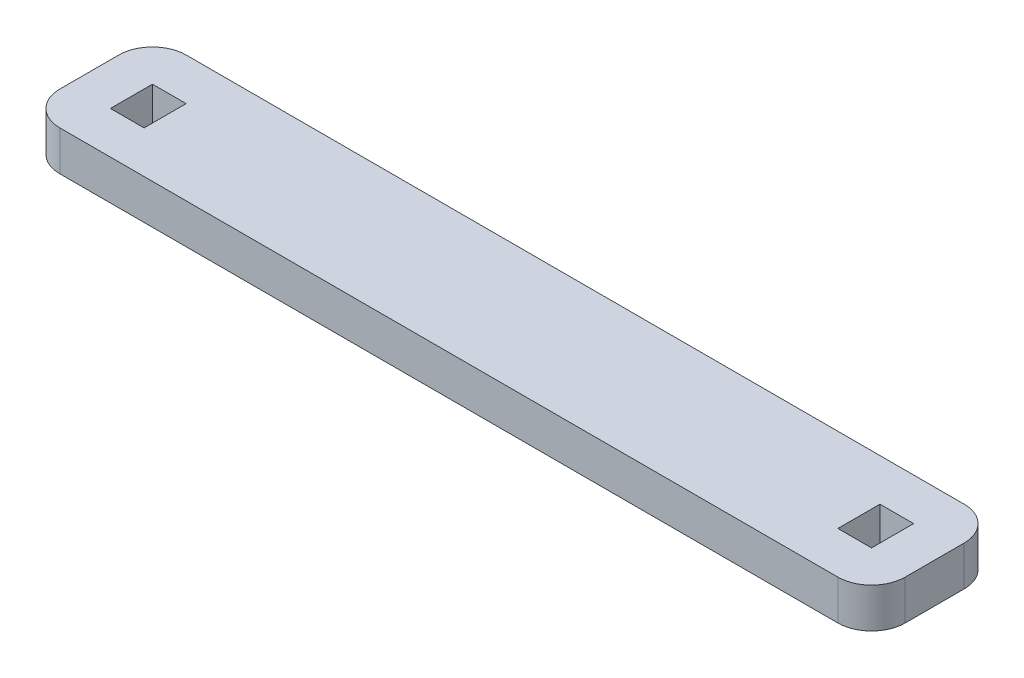
ISO-10303-21;
HEADER;
FILE_DESCRIPTION(('STEP AP214'),'2;1');
FILE_NAME('part.step','',(''),(''),'','','');
FILE_SCHEMA(('AUTOMOTIVE_DESIGN { 1 0 10303 214 1 1 1 1 }'));
ENDSEC;
DATA;
#1=APPLICATION_CONTEXT('core data for automotive mechanical design processes');
#2=APPLICATION_PROTOCOL_DEFINITION('international standard','automotive_design',2000,#1);
#3=PRODUCT_CONTEXT('',#1,'mechanical');
#4=PRODUCT('Part','Part','',(#3));
#5=PRODUCT_RELATED_PRODUCT_CATEGORY('part','',(#4));
#6=PRODUCT_DEFINITION_FORMATION('','',#4);
#7=PRODUCT_DEFINITION_CONTEXT('part definition',#1,'design');
#8=PRODUCT_DEFINITION('design','',#6,#7);
#9=PRODUCT_DEFINITION_SHAPE('','',#8);
#10=(LENGTH_UNIT() NAMED_UNIT(*) SI_UNIT(.MILLI.,.METRE.));
#11=(NAMED_UNIT(*) PLANE_ANGLE_UNIT() SI_UNIT($,.RADIAN.));
#12=(NAMED_UNIT(*) SI_UNIT($,.STERADIAN.) SOLID_ANGLE_UNIT());
#13=UNCERTAINTY_MEASURE_WITH_UNIT(LENGTH_MEASURE(1.E-05),#10,'distance_accuracy_value','');
#14=(GEOMETRIC_REPRESENTATION_CONTEXT(3) GLOBAL_UNCERTAINTY_ASSIGNED_CONTEXT((#13)) GLOBAL_UNIT_ASSIGNED_CONTEXT((#10,
#11,#12)) REPRESENTATION_CONTEXT('',''));
#15=CARTESIAN_POINT('',(0.,0.,0.));
#16=DIRECTION('',(0.,0.,1.));
#17=DIRECTION('',(1.,0.,0.));
#18=AXIS2_PLACEMENT_3D('',#15,#16,#17);
#19=CARTESIAN_POINT('',(0.,1.5,0.));
#20=DIRECTION('',(0.,1.,0.));
#21=DIRECTION('',(0.,0.,1.));
#22=AXIS2_PLACEMENT_3D('',#19,#20,#21);
#23=PLANE('',#22);
#24=DIRECTION('',(-1.,0.,0.));
#25=VECTOR('',#24,1.);
#26=CARTESIAN_POINT('',(31.877,1.5,-4.7625));
#27=LINE('',#26,#25);
#28=CARTESIAN_POINT('',(29.337,1.5,-4.7625));
#29=VERTEX_POINT('',#28);
#30=CARTESIAN_POINT('',(-29.337,1.5,-4.7625));
#31=VERTEX_POINT('',#30);
#32=EDGE_CURVE('E274',#29,#31,#27,.T.);
#33=ORIENTED_EDGE('',*,*,#32,.T.);
#34=CARTESIAN_POINT('',(-29.337,1.5,-2.2225));
#35=DIRECTION('',(0.,1.,0.));
#36=DIRECTION('',(0.,0.,1.));
#37=AXIS2_PLACEMENT_3D('',#34,#35,#36);
#38=CIRCLE('',#37,2.54);
#39=CARTESIAN_POINT('',(-31.877,1.5,-2.2225));
#40=VERTEX_POINT('',#39);
#41=EDGE_CURVE('E310',#31,#40,#38,.T.);
#42=ORIENTED_EDGE('',*,*,#41,.T.);
#43=DIRECTION('',(0.,0.,1.));
#44=VECTOR('',#43,1.);
#45=CARTESIAN_POINT('',(-31.877,1.5,4.7625));
#46=LINE('',#45,#44);
#47=CARTESIAN_POINT('',(-31.877,1.5,2.2225));
#48=VERTEX_POINT('',#47);
#49=EDGE_CURVE('E244',#40,#48,#46,.T.);
#50=ORIENTED_EDGE('',*,*,#49,.T.);
#51=CARTESIAN_POINT('',(-29.337,1.5,2.2225));
#52=DIRECTION('',(0.,1.,0.));
#53=DIRECTION('',(0.,0.,1.));
#54=AXIS2_PLACEMENT_3D('',#51,#52,#53);
#55=CIRCLE('',#54,2.54);
#56=CARTESIAN_POINT('',(-29.337,1.5,4.7625));
#57=VERTEX_POINT('',#56);
#58=EDGE_CURVE('E260',#48,#57,#55,.T.);
#59=ORIENTED_EDGE('',*,*,#58,.T.);
#60=DIRECTION('',(1.,0.,0.));
#61=VECTOR('',#60,1.);
#62=CARTESIAN_POINT('',(31.877,1.5,4.7625));
#63=LINE('',#62,#61);
#64=CARTESIAN_POINT('',(29.337,1.5,4.7625));
#65=VERTEX_POINT('',#64);
#66=EDGE_CURVE('E248',#57,#65,#63,.T.);
#67=ORIENTED_EDGE('',*,*,#66,.T.);
#68=CARTESIAN_POINT('',(29.337,1.5,2.2225));
#69=DIRECTION('',(0.,1.,0.));
#70=DIRECTION('',(0.,0.,1.));
#71=AXIS2_PLACEMENT_3D('',#68,#69,#70);
#72=CIRCLE('',#71,2.54);
#73=CARTESIAN_POINT('',(31.877,1.5,2.2225));
#74=VERTEX_POINT('',#73);
#75=EDGE_CURVE('E66',#65,#74,#72,.T.);
#76=ORIENTED_EDGE('',*,*,#75,.T.);
#77=DIRECTION('',(0.,0.,-1.));
#78=VECTOR('',#77,1.);
#79=CARTESIAN_POINT('',(31.877,1.5,4.7625));
#80=LINE('',#79,#78);
#81=CARTESIAN_POINT('',(31.877,1.5,-2.2225));
#82=VERTEX_POINT('',#81);
#83=EDGE_CURVE('E271',#74,#82,#80,.T.);
#84=ORIENTED_EDGE('',*,*,#83,.T.);
#85=CARTESIAN_POINT('',(29.337,1.5,-2.2225));
#86=DIRECTION('',(0.,1.,0.));
#87=DIRECTION('',(0.,0.,1.));
#88=AXIS2_PLACEMENT_3D('',#85,#86,#87);
#89=CIRCLE('',#88,2.54);
#90=EDGE_CURVE('E268',#82,#29,#89,.T.);
#91=ORIENTED_EDGE('',*,*,#90,.T.);
#92=EDGE_LOOP('',(#33,#42,#50,#59,#67,#76,#84,#91));
#93=FACE_BOUND('',#92,.T.);
#94=DIRECTION('',(1.,0.,0.));
#95=VECTOR('',#94,1.);
#96=CARTESIAN_POINT('',(-26.162,1.5,1.5875));
#97=LINE('',#96,#95);
#98=CARTESIAN_POINT('',(-28.702,1.5,1.5875));
#99=VERTEX_POINT('',#98);
#100=CARTESIAN_POINT('',(-26.162,1.5,1.5875));
#101=VERTEX_POINT('',#100);
#102=EDGE_CURVE('E211',#99,#101,#97,.T.);
#103=ORIENTED_EDGE('',*,*,#102,.F.);
#104=DIRECTION('',(0.,0.,1.));
#105=VECTOR('',#104,1.);
#106=CARTESIAN_POINT('',(-28.702,1.5,1.5875));
#107=LINE('',#106,#105);
#108=CARTESIAN_POINT('',(-28.702,1.5,-1.5875));
#109=VERTEX_POINT('',#108);
#110=EDGE_CURVE('E208',#109,#99,#107,.T.);
#111=ORIENTED_EDGE('',*,*,#110,.F.);
#112=DIRECTION('',(-1.,0.,0.));
#113=VECTOR('',#112,1.);
#114=CARTESIAN_POINT('',(-26.162,1.5,-1.5875));
#115=LINE('',#114,#113);
#116=CARTESIAN_POINT('',(-26.162,1.5,-1.5875));
#117=VERTEX_POINT('',#116);
#118=EDGE_CURVE('E218',#117,#109,#115,.T.);
#119=ORIENTED_EDGE('',*,*,#118,.F.);
#120=DIRECTION('',(0.,0.,-1.));
#121=VECTOR('',#120,1.);
#122=CARTESIAN_POINT('',(-26.162,1.5,1.5875));
#123=LINE('',#122,#121);
#124=EDGE_CURVE('E222',#101,#117,#123,.T.);
#125=ORIENTED_EDGE('',*,*,#124,.F.);
#126=EDGE_LOOP('',(#103,#111,#119,#125));
#127=FACE_BOUND('',#126,.T.);
#128=DIRECTION('',(1.,0.,0.));
#129=VECTOR('',#128,1.);
#130=CARTESIAN_POINT('',(28.702,1.5,1.5875));
#131=LINE('',#130,#129);
#132=CARTESIAN_POINT('',(26.162,1.5,1.5875));
#133=VERTEX_POINT('',#132);
#134=CARTESIAN_POINT('',(28.702,1.5,1.5875));
#135=VERTEX_POINT('',#134);
#136=EDGE_CURVE('E169',#133,#135,#131,.T.);
#137=ORIENTED_EDGE('',*,*,#136,.F.);
#138=DIRECTION('',(0.,0.,1.));
#139=VECTOR('',#138,1.);
#140=CARTESIAN_POINT('',(26.162,1.5,1.5875));
#141=LINE('',#140,#139);
#142=CARTESIAN_POINT('',(26.162,1.5,-1.5875));
#143=VERTEX_POINT('',#142);
#144=EDGE_CURVE('E159',#143,#133,#141,.T.);
#145=ORIENTED_EDGE('',*,*,#144,.F.);
#146=DIRECTION('',(-1.,0.,0.));
#147=VECTOR('',#146,1.);
#148=CARTESIAN_POINT('',(28.702,1.5,-1.5875));
#149=LINE('',#148,#147);
#150=CARTESIAN_POINT('',(28.702,1.5,-1.5875));
#151=VERTEX_POINT('',#150);
#152=EDGE_CURVE('E184',#151,#143,#149,.T.);
#153=ORIENTED_EDGE('',*,*,#152,.F.);
#154=DIRECTION('',(0.,0.,-1.));
#155=VECTOR('',#154,1.);
#156=CARTESIAN_POINT('',(28.702,1.5,1.5875));
#157=LINE('',#156,#155);
#158=EDGE_CURVE('E182',#135,#151,#157,.T.);
#159=ORIENTED_EDGE('',*,*,#158,.F.);
#160=EDGE_LOOP('',(#137,#145,#153,#159));
#161=FACE_BOUND('',#160,.T.);
#162=ADVANCED_FACE('F44',(#93,#127,#161),#23,.T.);
#163=CARTESIAN_POINT('',(0.,-1.5,0.));
#164=DIRECTION('',(0.,1.,0.));
#165=DIRECTION('',(0.,0.,1.));
#166=AXIS2_PLACEMENT_3D('',#163,#164,#165);
#167=PLANE('',#166);
#168=DIRECTION('',(0.,0.,1.));
#169=VECTOR('',#168,1.);
#170=CARTESIAN_POINT('',(-28.702,-1.5,1.5875));
#171=LINE('',#170,#169);
#172=CARTESIAN_POINT('',(-28.702,-1.5,-1.5875));
#173=VERTEX_POINT('',#172);
#174=CARTESIAN_POINT('',(-28.702,-1.5,1.5875));
#175=VERTEX_POINT('',#174);
#176=EDGE_CURVE('E177',#173,#175,#171,.T.);
#177=ORIENTED_EDGE('',*,*,#176,.T.);
#178=DIRECTION('',(1.,0.,0.));
#179=VECTOR('',#178,1.);
#180=CARTESIAN_POINT('',(-26.162,-1.5,1.5875));
#181=LINE('',#180,#179);
#182=CARTESIAN_POINT('',(-26.162,-1.5,1.5875));
#183=VERTEX_POINT('',#182);
#184=EDGE_CURVE('E226',#175,#183,#181,.T.);
#185=ORIENTED_EDGE('',*,*,#184,.T.);
#186=DIRECTION('',(0.,0.,-1.));
#187=VECTOR('',#186,1.);
#188=CARTESIAN_POINT('',(-26.162,-1.5,1.5875));
#189=LINE('',#188,#187);
#190=CARTESIAN_POINT('',(-26.162,-1.5,-1.5875));
#191=VERTEX_POINT('',#190);
#192=EDGE_CURVE('E229',#183,#191,#189,.T.);
#193=ORIENTED_EDGE('',*,*,#192,.T.);
#194=DIRECTION('',(-1.,0.,0.));
#195=VECTOR('',#194,1.);
#196=CARTESIAN_POINT('',(-26.162,-1.5,-1.5875));
#197=LINE('',#196,#195);
#198=EDGE_CURVE('E212',#191,#173,#197,.T.);
#199=ORIENTED_EDGE('',*,*,#198,.T.);
#200=EDGE_LOOP('',(#177,#185,#193,#199));
#201=FACE_BOUND('',#200,.T.);
#202=DIRECTION('',(0.,0.,1.));
#203=VECTOR('',#202,1.);
#204=CARTESIAN_POINT('',(-31.877,-1.5,4.7625));
#205=LINE('',#204,#203);
#206=CARTESIAN_POINT('',(-31.877,-1.5,-2.2225));
#207=VERTEX_POINT('',#206);
#208=CARTESIAN_POINT('',(-31.877,-1.5,2.2225));
#209=VERTEX_POINT('',#208);
#210=EDGE_CURVE('E243',#207,#209,#205,.T.);
#211=ORIENTED_EDGE('',*,*,#210,.F.);
#212=CARTESIAN_POINT('',(-29.337,-1.5,-2.2225));
#213=DIRECTION('',(0.,1.,0.));
#214=DIRECTION('',(0.,0.,1.));
#215=AXIS2_PLACEMENT_3D('',#212,#213,#214);
#216=CIRCLE('',#215,2.54);
#217=CARTESIAN_POINT('',(-29.337,-1.5,-4.7625));
#218=VERTEX_POINT('',#217);
#219=EDGE_CURVE('E298',#207,#218,#216,.F.);
#220=ORIENTED_EDGE('',*,*,#219,.T.);
#221=DIRECTION('',(-1.,0.,0.));
#222=VECTOR('',#221,1.);
#223=CARTESIAN_POINT('',(31.877,-1.5,-4.7625));
#224=LINE('',#223,#222);
#225=CARTESIAN_POINT('',(29.337,-1.5,-4.7625));
#226=VERTEX_POINT('',#225);
#227=EDGE_CURVE('E249',#226,#218,#224,.T.);
#228=ORIENTED_EDGE('',*,*,#227,.F.);
#229=CARTESIAN_POINT('',(29.337,-1.5,-2.2225));
#230=DIRECTION('',(0.,1.,0.));
#231=DIRECTION('',(0.,0.,1.));
#232=AXIS2_PLACEMENT_3D('',#229,#230,#231);
#233=CIRCLE('',#232,2.54);
#234=CARTESIAN_POINT('',(31.877,-1.5,-2.2225));
#235=VERTEX_POINT('',#234);
#236=EDGE_CURVE('E296',#226,#235,#233,.F.);
#237=ORIENTED_EDGE('',*,*,#236,.T.);
#238=DIRECTION('',(0.,0.,-1.));
#239=VECTOR('',#238,1.);
#240=CARTESIAN_POINT('',(31.877,-1.5,4.7625));
#241=LINE('',#240,#239);
#242=CARTESIAN_POINT('',(31.877,-1.5,2.2225));
#243=VERTEX_POINT('',#242);
#244=EDGE_CURVE('E284',#243,#235,#241,.T.);
#245=ORIENTED_EDGE('',*,*,#244,.F.);
#246=CARTESIAN_POINT('',(29.337,-1.5,2.2225));
#247=DIRECTION('',(0.,1.,0.));
#248=DIRECTION('',(0.,0.,1.));
#249=AXIS2_PLACEMENT_3D('',#246,#247,#248);
#250=CIRCLE('',#249,2.54);
#251=CARTESIAN_POINT('',(29.337,-1.5,4.7625));
#252=VERTEX_POINT('',#251);
#253=EDGE_CURVE('E294',#243,#252,#250,.F.);
#254=ORIENTED_EDGE('',*,*,#253,.T.);
#255=DIRECTION('',(1.,0.,0.));
#256=VECTOR('',#255,1.);
#257=CARTESIAN_POINT('',(31.877,-1.5,4.7625));
#258=LINE('',#257,#256);
#259=CARTESIAN_POINT('',(-29.337,-1.5,4.7625));
#260=VERTEX_POINT('',#259);
#261=EDGE_CURVE('E281',#260,#252,#258,.T.);
#262=ORIENTED_EDGE('',*,*,#261,.F.);
#263=CARTESIAN_POINT('',(-29.337,-1.5,2.2225));
#264=DIRECTION('',(0.,1.,0.));
#265=DIRECTION('',(0.,0.,1.));
#266=AXIS2_PLACEMENT_3D('',#263,#264,#265);
#267=CIRCLE('',#266,2.54);
#268=EDGE_CURVE('E292',#260,#209,#267,.F.);
#269=ORIENTED_EDGE('',*,*,#268,.T.);
#270=EDGE_LOOP('',(#211,#220,#228,#237,#245,#254,#262,#269));
#271=FACE_BOUND('',#270,.T.);
#272=DIRECTION('',(0.,0.,1.));
#273=VECTOR('',#272,1.);
#274=CARTESIAN_POINT('',(26.162,-1.5,1.5875));
#275=LINE('',#274,#273);
#276=CARTESIAN_POINT('',(26.162,-1.5,-1.5875));
#277=VERTEX_POINT('',#276);
#278=CARTESIAN_POINT('',(26.162,-1.5,1.5875));
#279=VERTEX_POINT('',#278);
#280=EDGE_CURVE('E196',#277,#279,#275,.T.);
#281=ORIENTED_EDGE('',*,*,#280,.T.);
#282=DIRECTION('',(1.,0.,0.));
#283=VECTOR('',#282,1.);
#284=CARTESIAN_POINT('',(28.702,-1.5,1.5875));
#285=LINE('',#284,#283);
#286=CARTESIAN_POINT('',(28.702,-1.5,1.5875));
#287=VERTEX_POINT('',#286);
#288=EDGE_CURVE('E176',#279,#287,#285,.T.);
#289=ORIENTED_EDGE('',*,*,#288,.T.);
#290=DIRECTION('',(0.,0.,-1.));
#291=VECTOR('',#290,1.);
#292=CARTESIAN_POINT('',(28.702,-1.5,1.5875));
#293=LINE('',#292,#291);
#294=CARTESIAN_POINT('',(28.702,-1.5,-1.5875));
#295=VERTEX_POINT('',#294);
#296=EDGE_CURVE('E199',#287,#295,#293,.T.);
#297=ORIENTED_EDGE('',*,*,#296,.T.);
#298=DIRECTION('',(-1.,0.,0.));
#299=VECTOR('',#298,1.);
#300=CARTESIAN_POINT('',(28.702,-1.5,-1.5875));
#301=LINE('',#300,#299);
#302=EDGE_CURVE('E170',#295,#277,#301,.T.);
#303=ORIENTED_EDGE('',*,*,#302,.T.);
#304=EDGE_LOOP('',(#281,#289,#297,#303));
#305=FACE_BOUND('',#304,.T.);
#306=ADVANCED_FACE('F331',(#201,#271,#305),#167,.F.);
#307=CARTESIAN_POINT('',(-31.877,1.5,4.7625));
#308=DIRECTION('',(1.,0.,0.));
#309=DIRECTION('',(0.,0.,-1.));
#310=AXIS2_PLACEMENT_3D('',#307,#308,#309);
#311=PLANE('',#310);
#312=ORIENTED_EDGE('',*,*,#49,.F.);
#313=DIRECTION('',(0.,-1.,0.));
#314=VECTOR('',#313,1.);
#315=CARTESIAN_POINT('',(-31.877,1.5,-2.2225));
#316=LINE('',#315,#314);
#317=EDGE_CURVE('E289',#40,#207,#316,.T.);
#318=ORIENTED_EDGE('',*,*,#317,.T.);
#319=ORIENTED_EDGE('',*,*,#210,.T.);
#320=DIRECTION('',(0.,-1.,0.));
#321=VECTOR('',#320,1.);
#322=CARTESIAN_POINT('',(-31.877,1.5,2.2225));
#323=LINE('',#322,#321);
#324=EDGE_CURVE('E278',#209,#48,#323,.F.);
#325=ORIENTED_EDGE('',*,*,#324,.T.);
#326=EDGE_LOOP('',(#312,#318,#319,#325));
#327=FACE_BOUND('',#326,.T.);
#328=ADVANCED_FACE('F341',(#327),#311,.F.);
#329=CARTESIAN_POINT('',(31.877,1.5,4.7625));
#330=DIRECTION('',(0.,0.,-1.));
#331=DIRECTION('',(-1.,0.,0.));
#332=AXIS2_PLACEMENT_3D('',#329,#330,#331);
#333=PLANE('',#332);
#334=ORIENTED_EDGE('',*,*,#261,.T.);
#335=DIRECTION('',(0.,-1.,0.));
#336=VECTOR('',#335,1.);
#337=CARTESIAN_POINT('',(29.337,1.5,4.7625));
#338=LINE('',#337,#336);
#339=EDGE_CURVE('E12',#252,#65,#338,.F.);
#340=ORIENTED_EDGE('',*,*,#339,.T.);
#341=ORIENTED_EDGE('',*,*,#66,.F.);
#342=DIRECTION('',(0.,-1.,0.));
#343=VECTOR('',#342,1.);
#344=CARTESIAN_POINT('',(-29.337,1.5,4.7625));
#345=LINE('',#344,#343);
#346=EDGE_CURVE('E52',#57,#260,#345,.T.);
#347=ORIENTED_EDGE('',*,*,#346,.T.);
#348=EDGE_LOOP('',(#334,#340,#341,#347));
#349=FACE_BOUND('',#348,.T.);
#350=ADVANCED_FACE('F325',(#349),#333,.F.);
#351=CARTESIAN_POINT('',(31.877,1.5,4.7625));
#352=DIRECTION('',(-1.,0.,0.));
#353=DIRECTION('',(0.,0.,1.));
#354=AXIS2_PLACEMENT_3D('',#351,#352,#353);
#355=PLANE('',#354);
#356=ORIENTED_EDGE('',*,*,#244,.T.);
#357=DIRECTION('',(0.,-1.,0.));
#358=VECTOR('',#357,1.);
#359=CARTESIAN_POINT('',(31.877,1.5,-2.2225));
#360=LINE('',#359,#358);
#361=EDGE_CURVE('E59',#235,#82,#360,.F.);
#362=ORIENTED_EDGE('',*,*,#361,.T.);
#363=ORIENTED_EDGE('',*,*,#83,.F.);
#364=DIRECTION('',(0.,-1.,0.));
#365=VECTOR('',#364,1.);
#366=CARTESIAN_POINT('',(31.877,1.5,2.2225));
#367=LINE('',#366,#365);
#368=EDGE_CURVE('E315',#74,#243,#367,.T.);
#369=ORIENTED_EDGE('',*,*,#368,.T.);
#370=EDGE_LOOP('',(#356,#362,#363,#369));
#371=FACE_BOUND('',#370,.T.);
#372=ADVANCED_FACE('F337',(#371),#355,.F.);
#373=CARTESIAN_POINT('',(31.877,1.5,-4.7625));
#374=DIRECTION('',(0.,0.,1.));
#375=DIRECTION('',(1.,0.,0.));
#376=AXIS2_PLACEMENT_3D('',#373,#374,#375);
#377=PLANE('',#376);
#378=ORIENTED_EDGE('',*,*,#227,.T.);
#379=DIRECTION('',(0.,-1.,0.));
#380=VECTOR('',#379,1.);
#381=CARTESIAN_POINT('',(-29.337,1.5,-4.7625));
#382=LINE('',#381,#380);
#383=EDGE_CURVE('E264',#218,#31,#382,.F.);
#384=ORIENTED_EDGE('',*,*,#383,.T.);
#385=ORIENTED_EDGE('',*,*,#32,.F.);
#386=DIRECTION('',(0.,-1.,0.));
#387=VECTOR('',#386,1.);
#388=CARTESIAN_POINT('',(29.337,1.5,-4.7625));
#389=LINE('',#388,#387);
#390=EDGE_CURVE('E299',#29,#226,#389,.T.);
#391=ORIENTED_EDGE('',*,*,#390,.T.);
#392=EDGE_LOOP('',(#378,#384,#385,#391));
#393=FACE_BOUND('',#392,.T.);
#394=ADVANCED_FACE('F306',(#393),#377,.F.);
#395=CARTESIAN_POINT('',(-28.702,1.5,1.5875));
#396=DIRECTION('',(1.,0.,0.));
#397=DIRECTION('',(0.,0.,-1.));
#398=AXIS2_PLACEMENT_3D('',#395,#396,#397);
#399=PLANE('',#398);
#400=ORIENTED_EDGE('',*,*,#176,.F.);
#401=DIRECTION('',(0.,-1.,0.));
#402=VECTOR('',#401,1.);
#403=CARTESIAN_POINT('',(-28.702,1.5,-1.5875));
#404=LINE('',#403,#402);
#405=EDGE_CURVE('E221',#109,#173,#404,.T.);
#406=ORIENTED_EDGE('',*,*,#405,.F.);
#407=ORIENTED_EDGE('',*,*,#110,.T.);
#408=DIRECTION('',(0.,-1.,0.));
#409=VECTOR('',#408,1.);
#410=CARTESIAN_POINT('',(-28.702,1.5,1.5875));
#411=LINE('',#410,#409);
#412=EDGE_CURVE('E240',#99,#175,#411,.T.);
#413=ORIENTED_EDGE('',*,*,#412,.T.);
#414=EDGE_LOOP('',(#400,#406,#407,#413));
#415=FACE_BOUND('',#414,.T.);
#416=ADVANCED_FACE('F356',(#415),#399,.T.);
#417=CARTESIAN_POINT('',(-26.162,1.5,1.5875));
#418=DIRECTION('',(0.,0.,-1.));
#419=DIRECTION('',(-1.,0.,0.));
#420=AXIS2_PLACEMENT_3D('',#417,#418,#419);
#421=PLANE('',#420);
#422=ORIENTED_EDGE('',*,*,#184,.F.);
#423=ORIENTED_EDGE('',*,*,#412,.F.);
#424=ORIENTED_EDGE('',*,*,#102,.T.);
#425=DIRECTION('',(0.,-1.,0.));
#426=VECTOR('',#425,1.);
#427=CARTESIAN_POINT('',(-26.162,1.5,1.5875));
#428=LINE('',#427,#426);
#429=EDGE_CURVE('E238',#101,#183,#428,.T.);
#430=ORIENTED_EDGE('',*,*,#429,.T.);
#431=EDGE_LOOP('',(#422,#423,#424,#430));
#432=FACE_BOUND('',#431,.T.);
#433=ADVANCED_FACE('F438',(#432),#421,.T.);
#434=CARTESIAN_POINT('',(-26.162,1.5,1.5875));
#435=DIRECTION('',(-1.,0.,0.));
#436=DIRECTION('',(0.,0.,1.));
#437=AXIS2_PLACEMENT_3D('',#434,#435,#436);
#438=PLANE('',#437);
#439=ORIENTED_EDGE('',*,*,#192,.F.);
#440=ORIENTED_EDGE('',*,*,#429,.F.);
#441=ORIENTED_EDGE('',*,*,#124,.T.);
#442=DIRECTION('',(0.,-1.,0.));
#443=VECTOR('',#442,1.);
#444=CARTESIAN_POINT('',(-26.162,1.5,-1.5875));
#445=LINE('',#444,#443);
#446=EDGE_CURVE('E236',#117,#191,#445,.T.);
#447=ORIENTED_EDGE('',*,*,#446,.T.);
#448=EDGE_LOOP('',(#439,#440,#441,#447));
#449=FACE_BOUND('',#448,.T.);
#450=ADVANCED_FACE('F429',(#449),#438,.T.);
#451=CARTESIAN_POINT('',(-26.162,1.5,-1.5875));
#452=DIRECTION('',(0.,0.,1.));
#453=DIRECTION('',(1.,0.,0.));
#454=AXIS2_PLACEMENT_3D('',#451,#452,#453);
#455=PLANE('',#454);
#456=ORIENTED_EDGE('',*,*,#198,.F.);
#457=ORIENTED_EDGE('',*,*,#446,.F.);
#458=ORIENTED_EDGE('',*,*,#118,.T.);
#459=ORIENTED_EDGE('',*,*,#405,.T.);
#460=EDGE_LOOP('',(#456,#457,#458,#459));
#461=FACE_BOUND('',#460,.T.);
#462=ADVANCED_FACE('F421',(#461),#455,.T.);
#463=CARTESIAN_POINT('',(26.162,1.5,1.5875));
#464=DIRECTION('',(1.,0.,0.));
#465=DIRECTION('',(0.,0.,-1.));
#466=AXIS2_PLACEMENT_3D('',#463,#464,#465);
#467=PLANE('',#466);
#468=ORIENTED_EDGE('',*,*,#280,.F.);
#469=DIRECTION('',(0.,-1.,0.));
#470=VECTOR('',#469,1.);
#471=CARTESIAN_POINT('',(26.162,1.5,-1.5875));
#472=LINE('',#471,#470);
#473=EDGE_CURVE('E165',#143,#277,#472,.T.);
#474=ORIENTED_EDGE('',*,*,#473,.F.);
#475=ORIENTED_EDGE('',*,*,#144,.T.);
#476=DIRECTION('',(0.,-1.,0.));
#477=VECTOR('',#476,1.);
#478=CARTESIAN_POINT('',(26.162,1.5,1.5875));
#479=LINE('',#478,#477);
#480=EDGE_CURVE('E162',#133,#279,#479,.T.);
#481=ORIENTED_EDGE('',*,*,#480,.T.);
#482=EDGE_LOOP('',(#468,#474,#475,#481));
#483=FACE_BOUND('',#482,.T.);
#484=ADVANCED_FACE('F161',(#483),#467,.T.);
#485=CARTESIAN_POINT('',(28.702,1.5,1.5875));
#486=DIRECTION('',(0.,0.,-1.));
#487=DIRECTION('',(-1.,0.,0.));
#488=AXIS2_PLACEMENT_3D('',#485,#486,#487);
#489=PLANE('',#488);
#490=ORIENTED_EDGE('',*,*,#288,.F.);
#491=ORIENTED_EDGE('',*,*,#480,.F.);
#492=ORIENTED_EDGE('',*,*,#136,.T.);
#493=DIRECTION('',(0.,-1.,0.));
#494=VECTOR('',#493,1.);
#495=CARTESIAN_POINT('',(28.702,1.5,1.5875));
#496=LINE('',#495,#494);
#497=EDGE_CURVE('E178',#135,#287,#496,.T.);
#498=ORIENTED_EDGE('',*,*,#497,.T.);
#499=EDGE_LOOP('',(#490,#491,#492,#498));
#500=FACE_BOUND('',#499,.T.);
#501=ADVANCED_FACE('F173',(#500),#489,.T.);
#502=CARTESIAN_POINT('',(28.702,1.5,1.5875));
#503=DIRECTION('',(-1.,0.,0.));
#504=DIRECTION('',(0.,0.,1.));
#505=AXIS2_PLACEMENT_3D('',#502,#503,#504);
#506=PLANE('',#505);
#507=ORIENTED_EDGE('',*,*,#296,.F.);
#508=ORIENTED_EDGE('',*,*,#497,.F.);
#509=ORIENTED_EDGE('',*,*,#158,.T.);
#510=DIRECTION('',(0.,-1.,0.));
#511=VECTOR('',#510,1.);
#512=CARTESIAN_POINT('',(28.702,1.5,-1.5875));
#513=LINE('',#512,#511);
#514=EDGE_CURVE('E205',#151,#295,#513,.T.);
#515=ORIENTED_EDGE('',*,*,#514,.T.);
#516=EDGE_LOOP('',(#507,#508,#509,#515));
#517=FACE_BOUND('',#516,.T.);
#518=ADVANCED_FACE('F397',(#517),#506,.T.);
#519=CARTESIAN_POINT('',(28.702,1.5,-1.5875));
#520=DIRECTION('',(0.,0.,1.));
#521=DIRECTION('',(1.,0.,0.));
#522=AXIS2_PLACEMENT_3D('',#519,#520,#521);
#523=PLANE('',#522);
#524=ORIENTED_EDGE('',*,*,#302,.F.);
#525=ORIENTED_EDGE('',*,*,#514,.F.);
#526=ORIENTED_EDGE('',*,*,#152,.T.);
#527=ORIENTED_EDGE('',*,*,#473,.T.);
#528=EDGE_LOOP('',(#524,#525,#526,#527));
#529=FACE_BOUND('',#528,.T.);
#530=ADVANCED_FACE('F369',(#529),#523,.T.);
#531=CARTESIAN_POINT('',(-29.337,1.5,-2.2225));
#532=DIRECTION('',(0.,-1.,0.));
#533=DIRECTION('',(0.,0.,-1.));
#534=AXIS2_PLACEMENT_3D('',#531,#532,#533);
#535=CYLINDRICAL_SURFACE('',#534,2.54);
#536=ORIENTED_EDGE('',*,*,#41,.F.);
#537=ORIENTED_EDGE('',*,*,#383,.F.);
#538=ORIENTED_EDGE('',*,*,#219,.F.);
#539=ORIENTED_EDGE('',*,*,#317,.F.);
#540=EDGE_LOOP('',(#536,#537,#538,#539));
#541=FACE_BOUND('',#540,.T.);
#542=ADVANCED_FACE('F314',(#541),#535,.T.);
#543=CARTESIAN_POINT('',(29.337,1.5,-2.2225));
#544=DIRECTION('',(0.,-1.,0.));
#545=DIRECTION('',(0.,0.,-1.));
#546=AXIS2_PLACEMENT_3D('',#543,#544,#545);
#547=CYLINDRICAL_SURFACE('',#546,2.54);
#548=ORIENTED_EDGE('',*,*,#90,.F.);
#549=ORIENTED_EDGE('',*,*,#361,.F.);
#550=ORIENTED_EDGE('',*,*,#236,.F.);
#551=ORIENTED_EDGE('',*,*,#390,.F.);
#552=EDGE_LOOP('',(#548,#549,#550,#551));
#553=FACE_BOUND('',#552,.T.);
#554=ADVANCED_FACE('F339',(#553),#547,.T.);
#555=CARTESIAN_POINT('',(29.337,1.5,2.2225));
#556=DIRECTION('',(0.,-1.,0.));
#557=DIRECTION('',(0.,0.,-1.));
#558=AXIS2_PLACEMENT_3D('',#555,#556,#557);
#559=CYLINDRICAL_SURFACE('',#558,2.54);
#560=ORIENTED_EDGE('',*,*,#75,.F.);
#561=ORIENTED_EDGE('',*,*,#339,.F.);
#562=ORIENTED_EDGE('',*,*,#253,.F.);
#563=ORIENTED_EDGE('',*,*,#368,.F.);
#564=EDGE_LOOP('',(#560,#561,#562,#563));
#565=FACE_BOUND('',#564,.T.);
#566=ADVANCED_FACE('F336',(#565),#559,.T.);
#567=CARTESIAN_POINT('',(-29.337,1.5,2.2225));
#568=DIRECTION('',(0.,-1.,0.));
#569=DIRECTION('',(0.,0.,-1.));
#570=AXIS2_PLACEMENT_3D('',#567,#568,#569);
#571=CYLINDRICAL_SURFACE('',#570,2.54);
#572=ORIENTED_EDGE('',*,*,#58,.F.);
#573=ORIENTED_EDGE('',*,*,#324,.F.);
#574=ORIENTED_EDGE('',*,*,#268,.F.);
#575=ORIENTED_EDGE('',*,*,#346,.F.);
#576=EDGE_LOOP('',(#572,#573,#574,#575));
#577=FACE_BOUND('',#576,.T.);
#578=ADVANCED_FACE('F46',(#577),#571,.T.);
#579=CLOSED_SHELL('',(#162,#306,#328,#350,#372,#394,#416,#433,#450,#462,#484,#501,#518,#530,
#542,#554,#566,#578));
#580=MANIFOLD_SOLID_BREP('B2',#579);
#581=ADVANCED_BREP_SHAPE_REPRESENTATION('',(#18,#580),#14);
#582=SHAPE_DEFINITION_REPRESENTATION(#9,#581);
ENDSEC;
END-ISO-10303-21;
